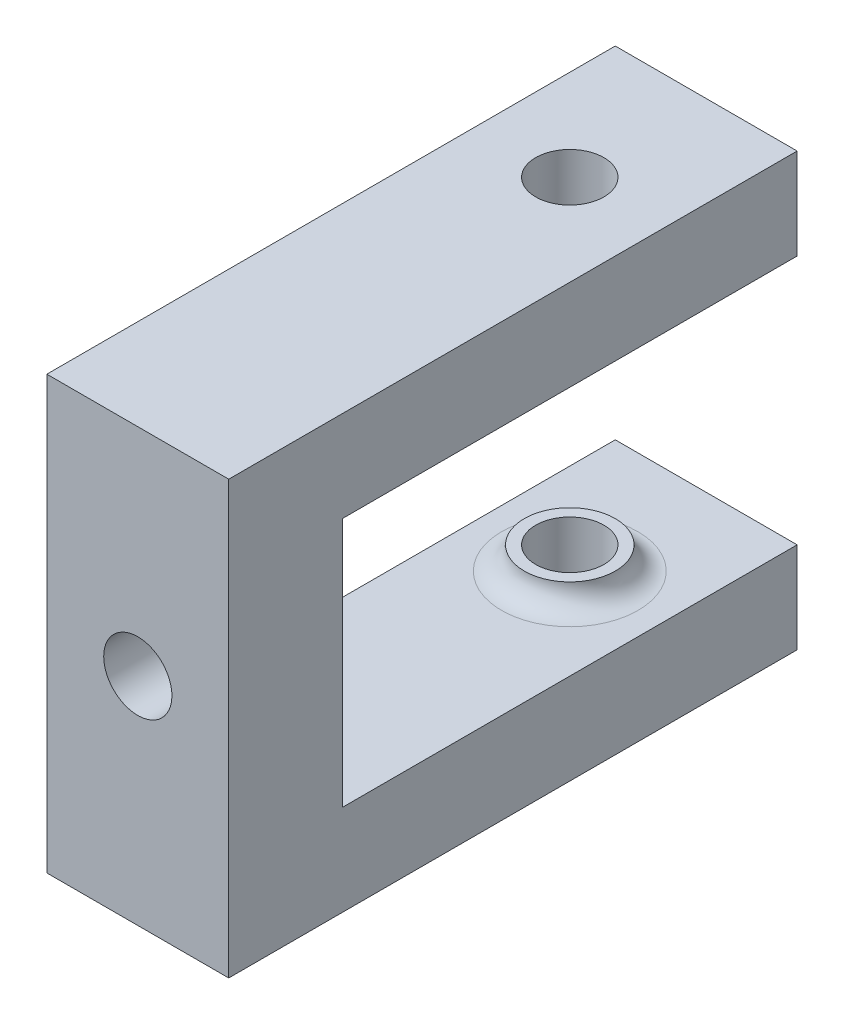
ISO-10303-21;
HEADER;
FILE_DESCRIPTION(('STEP AP214'),'2;1');
FILE_NAME('part.step','',(''),(''),'','','');
FILE_SCHEMA(('AUTOMOTIVE_DESIGN { 1 0 10303 214 1 1 1 1 }'));
ENDSEC;
DATA;
#1=APPLICATION_CONTEXT('core data for automotive mechanical design processes');
#2=APPLICATION_PROTOCOL_DEFINITION('international standard','automotive_design',2000,#1);
#3=PRODUCT_CONTEXT('',#1,'mechanical');
#4=PRODUCT('Part','Part','',(#3));
#5=PRODUCT_RELATED_PRODUCT_CATEGORY('part','',(#4));
#6=PRODUCT_DEFINITION_FORMATION('','',#4);
#7=PRODUCT_DEFINITION_CONTEXT('part definition',#1,'design');
#8=PRODUCT_DEFINITION('design','',#6,#7);
#9=PRODUCT_DEFINITION_SHAPE('','',#8);
#10=(LENGTH_UNIT() NAMED_UNIT(*) SI_UNIT(.MILLI.,.METRE.));
#11=(NAMED_UNIT(*) PLANE_ANGLE_UNIT() SI_UNIT($,.RADIAN.));
#12=(NAMED_UNIT(*) SI_UNIT($,.STERADIAN.) SOLID_ANGLE_UNIT());
#13=UNCERTAINTY_MEASURE_WITH_UNIT(LENGTH_MEASURE(1.E-05),#10,'distance_accuracy_value','');
#14=(GEOMETRIC_REPRESENTATION_CONTEXT(3) GLOBAL_UNCERTAINTY_ASSIGNED_CONTEXT((#13)) GLOBAL_UNIT_ASSIGNED_CONTEXT((#10,
#11,#12)) REPRESENTATION_CONTEXT('',''));
#15=CARTESIAN_POINT('',(0.,0.,0.));
#16=DIRECTION('',(0.,0.,1.));
#17=DIRECTION('',(1.,0.,0.));
#18=AXIS2_PLACEMENT_3D('',#15,#16,#17);
#19=CARTESIAN_POINT('',(4.,9.5,4.24264068711928));
#20=DIRECTION('',(0.,0.,-1.));
#21=DIRECTION('',(-1.,0.,0.));
#22=AXIS2_PLACEMENT_3D('',#19,#20,#21);
#23=CYLINDRICAL_SURFACE('',#22,1.5);
#24=CARTESIAN_POINT('',(4.,9.5,0.));
#25=DIRECTION('',(0.,0.,-1.));
#26=DIRECTION('',(0.,1.,0.));
#27=AXIS2_PLACEMENT_3D('',#24,#25,#26);
#28=CIRCLE('',#27,1.5);
#29=CARTESIAN_POINT('',(4.,11.,0.));
#30=VERTEX_POINT('',#29);
#31=EDGE_CURVE('E281',#30,#30,#28,.F.);
#32=ORIENTED_EDGE('',*,*,#31,.T.);
#33=EDGE_LOOP('',(#32));
#34=FACE_BOUND('',#33,.T.);
#35=CARTESIAN_POINT('',(4.,9.5,-3.));
#36=DIRECTION('',(0.,0.,-1.));
#37=DIRECTION('',(-1.,0.,0.));
#38=AXIS2_PLACEMENT_3D('',#35,#36,#37);
#39=CIRCLE('',#38,1.5);
#40=CARTESIAN_POINT('',(2.5,9.5,-3.));
#41=VERTEX_POINT('',#40);
#42=EDGE_CURVE('E39',#41,#41,#39,.F.);
#43=ORIENTED_EDGE('',*,*,#42,.F.);
#44=EDGE_LOOP('',(#43));
#45=FACE_BOUND('',#44,.T.);
#46=ADVANCED_FACE('F35',(#34,#45),#23,.F.);
#47=CARTESIAN_POINT('',(8.,15.,-5.));
#48=DIRECTION('',(0.,1.,0.));
#49=DIRECTION('',(0.,0.,1.));
#50=AXIS2_PLACEMENT_3D('',#47,#48,#49);
#51=PLANE('',#50);
#52=CARTESIAN_POINT('',(4.,15.,-19.));
#53=DIRECTION('',(0.,1.,0.));
#54=DIRECTION('',(0.,0.,1.));
#55=AXIS2_PLACEMENT_3D('',#52,#53,#54);
#56=CIRCLE('',#55,3.);
#57=CARTESIAN_POINT('',(4.,15.,-16.));
#58=VERTEX_POINT('',#57);
#59=EDGE_CURVE('E11',#58,#58,#56,.T.);
#60=ORIENTED_EDGE('',*,*,#59,.T.);
#61=EDGE_LOOP('',(#60));
#62=FACE_BOUND('',#61,.T.);
#63=DIRECTION('',(0.,0.,-1.));
#64=VECTOR('',#63,1.);
#65=CARTESIAN_POINT('',(0.,15.,-5.));
#66=LINE('',#65,#64);
#67=CARTESIAN_POINT('',(0.,15.,-5.));
#68=VERTEX_POINT('',#67);
#69=CARTESIAN_POINT('',(0.,15.,-25.));
#70=VERTEX_POINT('',#69);
#71=EDGE_CURVE('E134',#68,#70,#66,.T.);
#72=ORIENTED_EDGE('',*,*,#71,.T.);
#73=DIRECTION('',(-1.,0.,0.));
#74=VECTOR('',#73,1.);
#75=CARTESIAN_POINT('',(8.,15.,-25.));
#76=LINE('',#75,#74);
#77=CARTESIAN_POINT('',(8.,15.,-25.));
#78=VERTEX_POINT('',#77);
#79=EDGE_CURVE('E131',#78,#70,#76,.T.);
#80=ORIENTED_EDGE('',*,*,#79,.F.);
#81=DIRECTION('',(0.,0.,-1.));
#82=VECTOR('',#81,1.);
#83=CARTESIAN_POINT('',(8.,15.,-5.));
#84=LINE('',#83,#82);
#85=CARTESIAN_POINT('',(8.,15.,-5.));
#86=VERTEX_POINT('',#85);
#87=EDGE_CURVE('E118',#86,#78,#84,.T.);
#88=ORIENTED_EDGE('',*,*,#87,.F.);
#89=DIRECTION('',(-1.,0.,0.));
#90=VECTOR('',#89,1.);
#91=CARTESIAN_POINT('',(8.,15.,-5.));
#92=LINE('',#91,#90);
#93=EDGE_CURVE('E137',#86,#68,#92,.T.);
#94=ORIENTED_EDGE('',*,*,#93,.T.);
#95=EDGE_LOOP('',(#72,#80,#88,#94));
#96=FACE_BOUND('',#95,.T.);
#97=ADVANCED_FACE('F132',(#62,#96),#51,.F.);
#98=CARTESIAN_POINT('',(8.,4.,-25.));
#99=DIRECTION('',(0.,-1.,0.));
#100=DIRECTION('',(0.,0.,-1.));
#101=AXIS2_PLACEMENT_3D('',#98,#99,#100);
#102=PLANE('',#101);
#103=CARTESIAN_POINT('',(4.,4.,-19.));
#104=DIRECTION('',(0.,-1.,0.));
#105=DIRECTION('',(0.,0.,-1.));
#106=AXIS2_PLACEMENT_3D('',#103,#104,#105);
#107=CIRCLE('',#106,3.);
#108=CARTESIAN_POINT('',(4.,4.,-22.));
#109=VERTEX_POINT('',#108);
#110=EDGE_CURVE('E44',#109,#109,#107,.T.);
#111=ORIENTED_EDGE('',*,*,#110,.T.);
#112=EDGE_LOOP('',(#111));
#113=FACE_BOUND('',#112,.T.);
#114=DIRECTION('',(0.,0.,1.));
#115=VECTOR('',#114,1.);
#116=CARTESIAN_POINT('',(0.,4.,-25.));
#117=LINE('',#116,#115);
#118=CARTESIAN_POINT('',(0.,4.,-25.));
#119=VERTEX_POINT('',#118);
#120=CARTESIAN_POINT('',(0.,4.,-5.));
#121=VERTEX_POINT('',#120);
#122=EDGE_CURVE('E154',#119,#121,#117,.T.);
#123=ORIENTED_EDGE('',*,*,#122,.T.);
#124=DIRECTION('',(-1.,0.,0.));
#125=VECTOR('',#124,1.);
#126=CARTESIAN_POINT('',(8.,4.,-5.));
#127=LINE('',#126,#125);
#128=CARTESIAN_POINT('',(8.,4.,-5.));
#129=VERTEX_POINT('',#128);
#130=EDGE_CURVE('E166',#129,#121,#127,.T.);
#131=ORIENTED_EDGE('',*,*,#130,.F.);
#132=DIRECTION('',(0.,0.,1.));
#133=VECTOR('',#132,1.);
#134=CARTESIAN_POINT('',(8.,4.,-25.));
#135=LINE('',#134,#133);
#136=CARTESIAN_POINT('',(8.,4.,-25.));
#137=VERTEX_POINT('',#136);
#138=EDGE_CURVE('E207',#137,#129,#135,.T.);
#139=ORIENTED_EDGE('',*,*,#138,.F.);
#140=DIRECTION('',(-1.,0.,0.));
#141=VECTOR('',#140,1.);
#142=CARTESIAN_POINT('',(8.,4.,-25.));
#143=LINE('',#142,#141);
#144=EDGE_CURVE('E169',#137,#119,#143,.T.);
#145=ORIENTED_EDGE('',*,*,#144,.T.);
#146=EDGE_LOOP('',(#123,#131,#139,#145));
#147=FACE_BOUND('',#146,.T.);
#148=ADVANCED_FACE('F180',(#113,#147),#102,.F.);
#149=CARTESIAN_POINT('',(8.,19.,0.));
#150=DIRECTION('',(0.,0.,-1.));
#151=DIRECTION('',(0.,1.,0.));
#152=AXIS2_PLACEMENT_3D('',#149,#150,#151);
#153=PLANE('',#152);
#154=ORIENTED_EDGE('',*,*,#31,.F.);
#155=EDGE_LOOP('',(#154));
#156=FACE_BOUND('',#155,.T.);
#157=DIRECTION('',(0.,-1.,0.));
#158=VECTOR('',#157,1.);
#159=CARTESIAN_POINT('',(0.,19.,0.));
#160=LINE('',#159,#158);
#161=CARTESIAN_POINT('',(0.,19.,0.));
#162=VERTEX_POINT('',#161);
#163=CARTESIAN_POINT('',(0.,0.,0.));
#164=VERTEX_POINT('',#163);
#165=EDGE_CURVE('E146',#162,#164,#160,.T.);
#166=ORIENTED_EDGE('',*,*,#165,.T.);
#167=DIRECTION('',(-1.,0.,0.));
#168=VECTOR('',#167,1.);
#169=CARTESIAN_POINT('',(8.,0.,0.));
#170=LINE('',#169,#168);
#171=CARTESIAN_POINT('',(8.,0.,0.));
#172=VERTEX_POINT('',#171);
#173=EDGE_CURVE('E175',#172,#164,#170,.T.);
#174=ORIENTED_EDGE('',*,*,#173,.F.);
#175=DIRECTION('',(0.,-1.,0.));
#176=VECTOR('',#175,1.);
#177=CARTESIAN_POINT('',(8.,19.,0.));
#178=LINE('',#177,#176);
#179=CARTESIAN_POINT('',(8.,19.,0.));
#180=VERTEX_POINT('',#179);
#181=EDGE_CURVE('E162',#180,#172,#178,.T.);
#182=ORIENTED_EDGE('',*,*,#181,.F.);
#183=DIRECTION('',(-1.,0.,0.));
#184=VECTOR('',#183,1.);
#185=CARTESIAN_POINT('',(8.,19.,0.));
#186=LINE('',#185,#184);
#187=EDGE_CURVE('E142',#180,#162,#186,.T.);
#188=ORIENTED_EDGE('',*,*,#187,.T.);
#189=EDGE_LOOP('',(#166,#174,#182,#188));
#190=FACE_BOUND('',#189,.T.);
#191=ADVANCED_FACE('F223',(#156,#190),#153,.F.);
#192=CARTESIAN_POINT('',(8.,0.,0.));
#193=DIRECTION('',(0.,1.,0.));
#194=DIRECTION('',(0.,0.,1.));
#195=AXIS2_PLACEMENT_3D('',#192,#193,#194);
#196=PLANE('',#195);
#197=CARTESIAN_POINT('',(4.,0.,-19.));
#198=DIRECTION('',(0.,1.,0.));
#199=DIRECTION('',(0.,0.,1.));
#200=AXIS2_PLACEMENT_3D('',#197,#198,#199);
#201=CIRCLE('',#200,1.5);
#202=CARTESIAN_POINT('',(4.,0.,-17.5));
#203=VERTEX_POINT('',#202);
#204=EDGE_CURVE('E150',#203,#203,#201,.F.);
#205=ORIENTED_EDGE('',*,*,#204,.F.);
#206=EDGE_LOOP('',(#205));
#207=FACE_BOUND('',#206,.T.);
#208=DIRECTION('',(0.,0.,-1.));
#209=VECTOR('',#208,1.);
#210=CARTESIAN_POINT('',(0.,0.,0.));
#211=LINE('',#210,#209);
#212=CARTESIAN_POINT('',(0.,0.,-25.));
#213=VERTEX_POINT('',#212);
#214=EDGE_CURVE('E149',#164,#213,#211,.T.);
#215=ORIENTED_EDGE('',*,*,#214,.T.);
#216=DIRECTION('',(-1.,0.,0.));
#217=VECTOR('',#216,1.);
#218=CARTESIAN_POINT('',(8.,0.,-25.));
#219=LINE('',#218,#217);
#220=CARTESIAN_POINT('',(8.,0.,-25.));
#221=VERTEX_POINT('',#220);
#222=EDGE_CURVE('E172',#221,#213,#219,.T.);
#223=ORIENTED_EDGE('',*,*,#222,.F.);
#224=DIRECTION('',(0.,0.,-1.));
#225=VECTOR('',#224,1.);
#226=CARTESIAN_POINT('',(8.,0.,0.));
#227=LINE('',#226,#225);
#228=EDGE_CURVE('E102',#172,#221,#227,.T.);
#229=ORIENTED_EDGE('',*,*,#228,.F.);
#230=ORIENTED_EDGE('',*,*,#173,.T.);
#231=EDGE_LOOP('',(#215,#223,#229,#230));
#232=FACE_BOUND('',#231,.T.);
#233=ADVANCED_FACE('F224',(#207,#232),#196,.F.);
#234=CARTESIAN_POINT('',(8.,0.,-25.));
#235=DIRECTION('',(0.,0.,1.));
#236=DIRECTION('',(1.,0.,0.));
#237=AXIS2_PLACEMENT_3D('',#234,#235,#236);
#238=PLANE('',#237);
#239=DIRECTION('',(0.,1.,0.));
#240=VECTOR('',#239,1.);
#241=CARTESIAN_POINT('',(0.,0.,-25.));
#242=LINE('',#241,#240);
#243=EDGE_CURVE('E152',#213,#119,#242,.T.);
#244=ORIENTED_EDGE('',*,*,#243,.T.);
#245=ORIENTED_EDGE('',*,*,#144,.F.);
#246=DIRECTION('',(0.,1.,0.));
#247=VECTOR('',#246,1.);
#248=CARTESIAN_POINT('',(8.,0.,-25.));
#249=LINE('',#248,#247);
#250=EDGE_CURVE('E205',#221,#137,#249,.T.);
#251=ORIENTED_EDGE('',*,*,#250,.F.);
#252=ORIENTED_EDGE('',*,*,#222,.T.);
#253=EDGE_LOOP('',(#244,#245,#251,#252));
#254=FACE_BOUND('',#253,.T.);
#255=ADVANCED_FACE('F227',(#254),#238,.F.);
#256=CARTESIAN_POINT('',(8.,4.,-5.));
#257=DIRECTION('',(0.,0.,1.));
#258=DIRECTION('',(1.,0.,0.));
#259=AXIS2_PLACEMENT_3D('',#256,#257,#258);
#260=PLANE('',#259);
#261=DIRECTION('',(0.870404047279502,0.492338089608616,0.));
#262=VECTOR('',#261,1.);
#263=CARTESIAN_POINT('',(1.26411822332476,11.1119194264571,-5.));
#264=LINE('',#263,#262);
#265=CARTESIAN_POINT('',(1.26411822332476,11.1119194264571,-5.));
#266=VERTEX_POINT('',#265);
#267=CARTESIAN_POINT('',(4.02802228382785,12.6753028335802,-5.));
#268=VERTEX_POINT('',#267);
#269=EDGE_CURVE('E334',#266,#268,#264,.T.);
#270=ORIENTED_EDGE('',*,*,#269,.F.);
#271=DIRECTION('',(0.00882473078798997,0.999961061305149,0.));
#272=VECTOR('',#271,1.);
#273=CARTESIAN_POINT('',(1.23609593949692,7.93661659287687,-5.));
#274=LINE('',#273,#272);
#275=CARTESIAN_POINT('',(1.23609593949692,7.93661659287687,-5.));
#276=VERTEX_POINT('',#275);
#277=EDGE_CURVE('E51',#276,#266,#274,.T.);
#278=ORIENTED_EDGE('',*,*,#277,.F.);
#279=DIRECTION('',(-0.861579316491512,0.507622971696533,0.));
#280=VECTOR('',#279,1.);
#281=CARTESIAN_POINT('',(3.97197771617216,6.3246971664198,-5.));
#282=LINE('',#281,#280);
#283=CARTESIAN_POINT('',(3.97197771617216,6.3246971664198,-5.));
#284=VERTEX_POINT('',#283);
#285=EDGE_CURVE('E358',#284,#276,#282,.T.);
#286=ORIENTED_EDGE('',*,*,#285,.F.);
#287=DIRECTION('',(-0.870404047279502,-0.492338089608617,0.));
#288=VECTOR('',#287,1.);
#289=CARTESIAN_POINT('',(6.73588177667524,7.88808057354293,-5.));
#290=LINE('',#289,#288);
#291=CARTESIAN_POINT('',(6.73588177667524,7.88808057354293,-5.));
#292=VERTEX_POINT('',#291);
#293=EDGE_CURVE('E352',#292,#284,#290,.T.);
#294=ORIENTED_EDGE('',*,*,#293,.F.);
#295=DIRECTION('',(-0.0088247307879899,-0.999961061305149,0.));
#296=VECTOR('',#295,1.);
#297=CARTESIAN_POINT('',(6.76390406050308,11.0633834071231,-5.));
#298=LINE('',#297,#296);
#299=CARTESIAN_POINT('',(6.76390406050308,11.0633834071231,-5.));
#300=VERTEX_POINT('',#299);
#301=EDGE_CURVE('E349',#300,#292,#298,.T.);
#302=ORIENTED_EDGE('',*,*,#301,.F.);
#303=DIRECTION('',(0.861579316491513,-0.507622971696532,0.));
#304=VECTOR('',#303,1.);
#305=CARTESIAN_POINT('',(4.02802228382785,12.6753028335802,-5.));
#306=LINE('',#305,#304);
#307=EDGE_CURVE('E343',#268,#300,#306,.T.);
#308=ORIENTED_EDGE('',*,*,#307,.F.);
#309=EDGE_LOOP('',(#270,#278,#286,#294,#302,#308));
#310=FACE_BOUND('',#309,.T.);
#311=DIRECTION('',(0.,1.,0.));
#312=VECTOR('',#311,1.);
#313=CARTESIAN_POINT('',(0.,4.,-5.));
#314=LINE('',#313,#312);
#315=EDGE_CURVE('E156',#121,#68,#314,.T.);
#316=ORIENTED_EDGE('',*,*,#315,.T.);
#317=ORIENTED_EDGE('',*,*,#93,.F.);
#318=DIRECTION('',(0.,1.,0.));
#319=VECTOR('',#318,1.);
#320=CARTESIAN_POINT('',(8.,4.,-5.));
#321=LINE('',#320,#319);
#322=EDGE_CURVE('E125',#129,#86,#321,.T.);
#323=ORIENTED_EDGE('',*,*,#322,.F.);
#324=ORIENTED_EDGE('',*,*,#130,.T.);
#325=EDGE_LOOP('',(#316,#317,#323,#324));
#326=FACE_BOUND('',#325,.T.);
#327=ADVANCED_FACE('F215',(#310,#326),#260,.F.);
#328=CARTESIAN_POINT('',(8.,15.,-25.));
#329=DIRECTION('',(0.,0.,1.));
#330=DIRECTION('',(1.,0.,0.));
#331=AXIS2_PLACEMENT_3D('',#328,#329,#330);
#332=PLANE('',#331);
#333=DIRECTION('',(0.,1.,0.));
#334=VECTOR('',#333,1.);
#335=CARTESIAN_POINT('',(0.,15.,-25.));
#336=LINE('',#335,#334);
#337=CARTESIAN_POINT('',(0.,19.,-25.));
#338=VERTEX_POINT('',#337);
#339=EDGE_CURVE('E159',#70,#338,#336,.T.);
#340=ORIENTED_EDGE('',*,*,#339,.T.);
#341=DIRECTION('',(-1.,0.,0.));
#342=VECTOR('',#341,1.);
#343=CARTESIAN_POINT('',(8.,19.,-25.));
#344=LINE('',#343,#342);
#345=CARTESIAN_POINT('',(8.,19.,-25.));
#346=VERTEX_POINT('',#345);
#347=EDGE_CURVE('E138',#346,#338,#344,.T.);
#348=ORIENTED_EDGE('',*,*,#347,.F.);
#349=DIRECTION('',(0.,1.,0.));
#350=VECTOR('',#349,1.);
#351=CARTESIAN_POINT('',(8.,15.,-25.));
#352=LINE('',#351,#350);
#353=EDGE_CURVE('E122',#78,#346,#352,.T.);
#354=ORIENTED_EDGE('',*,*,#353,.F.);
#355=ORIENTED_EDGE('',*,*,#79,.T.);
#356=EDGE_LOOP('',(#340,#348,#354,#355));
#357=FACE_BOUND('',#356,.T.);
#358=ADVANCED_FACE('F140',(#357),#332,.F.);
#359=CARTESIAN_POINT('',(8.,19.,-25.));
#360=DIRECTION('',(0.,-1.,0.));
#361=DIRECTION('',(0.,0.,-1.));
#362=AXIS2_PLACEMENT_3D('',#359,#360,#361);
#363=PLANE('',#362);
#364=CARTESIAN_POINT('',(4.,19.,-19.));
#365=DIRECTION('',(0.,1.,0.));
#366=DIRECTION('',(0.,0.,1.));
#367=AXIS2_PLACEMENT_3D('',#364,#365,#366);
#368=CIRCLE('',#367,1.5);
#369=CARTESIAN_POINT('',(4.,19.,-17.5));
#370=VERTEX_POINT('',#369);
#371=EDGE_CURVE('E191',#370,#370,#368,.T.);
#372=ORIENTED_EDGE('',*,*,#371,.F.);
#373=EDGE_LOOP('',(#372));
#374=FACE_BOUND('',#373,.T.);
#375=DIRECTION('',(0.,0.,1.));
#376=VECTOR('',#375,1.);
#377=CARTESIAN_POINT('',(0.,19.,-25.));
#378=LINE('',#377,#376);
#379=EDGE_CURVE('E93',#338,#162,#378,.T.);
#380=ORIENTED_EDGE('',*,*,#379,.T.);
#381=ORIENTED_EDGE('',*,*,#187,.F.);
#382=DIRECTION('',(0.,0.,1.));
#383=VECTOR('',#382,1.);
#384=CARTESIAN_POINT('',(8.,19.,-25.));
#385=LINE('',#384,#383);
#386=EDGE_CURVE('E60',#346,#180,#385,.T.);
#387=ORIENTED_EDGE('',*,*,#386,.F.);
#388=ORIENTED_EDGE('',*,*,#347,.T.);
#389=EDGE_LOOP('',(#380,#381,#387,#388));
#390=FACE_BOUND('',#389,.T.);
#391=ADVANCED_FACE('F219',(#374,#390),#363,.F.);
#392=CARTESIAN_POINT('',(8.,0.,0.));
#393=DIRECTION('',(1.,0.,0.));
#394=DIRECTION('',(0.,0.,-1.));
#395=AXIS2_PLACEMENT_3D('',#392,#393,#394);
#396=PLANE('',#395);
#397=ORIENTED_EDGE('',*,*,#181,.T.);
#398=ORIENTED_EDGE('',*,*,#228,.T.);
#399=ORIENTED_EDGE('',*,*,#250,.T.);
#400=ORIENTED_EDGE('',*,*,#138,.T.);
#401=ORIENTED_EDGE('',*,*,#322,.T.);
#402=ORIENTED_EDGE('',*,*,#87,.T.);
#403=ORIENTED_EDGE('',*,*,#353,.T.);
#404=ORIENTED_EDGE('',*,*,#386,.T.);
#405=EDGE_LOOP('',(#397,#398,#399,#400,#401,#402,#403,#404));
#406=FACE_BOUND('',#405,.T.);
#407=ADVANCED_FACE('F120',(#406),#396,.T.);
#408=CARTESIAN_POINT('',(0.,0.,0.));
#409=DIRECTION('',(1.,0.,0.));
#410=DIRECTION('',(0.,0.,-1.));
#411=AXIS2_PLACEMENT_3D('',#408,#409,#410);
#412=PLANE('',#411);
#413=ORIENTED_EDGE('',*,*,#165,.F.);
#414=ORIENTED_EDGE('',*,*,#379,.F.);
#415=ORIENTED_EDGE('',*,*,#339,.F.);
#416=ORIENTED_EDGE('',*,*,#71,.F.);
#417=ORIENTED_EDGE('',*,*,#315,.F.);
#418=ORIENTED_EDGE('',*,*,#122,.F.);
#419=ORIENTED_EDGE('',*,*,#243,.F.);
#420=ORIENTED_EDGE('',*,*,#214,.F.);
#421=EDGE_LOOP('',(#413,#414,#415,#416,#417,#418,#419,#420));
#422=FACE_BOUND('',#421,.T.);
#423=ADVANCED_FACE('F218',(#422),#412,.F.);
#424=CARTESIAN_POINT('',(4.,-4.24264068711929,-19.));
#425=DIRECTION('',(0.,1.,0.));
#426=DIRECTION('',(0.,0.,1.));
#427=AXIS2_PLACEMENT_3D('',#424,#425,#426);
#428=CYLINDRICAL_SURFACE('',#427,1.5);
#429=ORIENTED_EDGE('',*,*,#371,.T.);
#430=EDGE_LOOP('',(#429));
#431=FACE_BOUND('',#430,.T.);
#432=CARTESIAN_POINT('',(4.,14.,-19.));
#433=DIRECTION('',(0.,-1.,0.));
#434=DIRECTION('',(0.,0.,-1.));
#435=AXIS2_PLACEMENT_3D('',#432,#433,#434);
#436=CIRCLE('',#435,1.5);
#437=CARTESIAN_POINT('',(4.,14.,-20.5));
#438=VERTEX_POINT('',#437);
#439=EDGE_CURVE('E282',#438,#438,#436,.T.);
#440=ORIENTED_EDGE('',*,*,#439,.T.);
#441=EDGE_LOOP('',(#440));
#442=FACE_BOUND('',#441,.T.);
#443=ADVANCED_FACE('F262',(#431,#442),#428,.F.);
#444=ORIENTED_EDGE('',*,*,#204,.T.);
#445=EDGE_LOOP('',(#444));
#446=FACE_BOUND('',#445,.T.);
#447=CARTESIAN_POINT('',(4.,5.,-19.));
#448=DIRECTION('',(0.,1.,0.));
#449=DIRECTION('',(0.,0.,1.));
#450=AXIS2_PLACEMENT_3D('',#447,#448,#449);
#451=CIRCLE('',#450,1.5);
#452=CARTESIAN_POINT('',(4.,5.,-17.5));
#453=VERTEX_POINT('',#452);
#454=EDGE_CURVE('E192',#453,#453,#451,.T.);
#455=ORIENTED_EDGE('',*,*,#454,.T.);
#456=EDGE_LOOP('',(#455));
#457=FACE_BOUND('',#456,.T.);
#458=ADVANCED_FACE('F259',(#446,#457),#428,.F.);
#459=CARTESIAN_POINT('',(4.,5.,-19.));
#460=DIRECTION('',(0.,1.,0.));
#461=DIRECTION('',(0.,0.,1.));
#462=AXIS2_PLACEMENT_3D('',#459,#460,#461);
#463=PLANE('',#462);
#464=CARTESIAN_POINT('',(4.,5.,-19.));
#465=DIRECTION('',(0.,1.,0.));
#466=DIRECTION('',(0.,0.,1.));
#467=AXIS2_PLACEMENT_3D('',#464,#465,#466);
#468=CIRCLE('',#467,2.);
#469=CARTESIAN_POINT('',(4.,5.,-17.));
#470=VERTEX_POINT('',#469);
#471=EDGE_CURVE('E189',#470,#470,#468,.T.);
#472=ORIENTED_EDGE('',*,*,#471,.T.);
#473=EDGE_LOOP('',(#472));
#474=FACE_BOUND('',#473,.T.);
#475=ORIENTED_EDGE('',*,*,#454,.F.);
#476=EDGE_LOOP('',(#475));
#477=FACE_BOUND('',#476,.T.);
#478=ADVANCED_FACE('F255',(#474,#477),#463,.T.);
#479=CARTESIAN_POINT('',(4.,14.,-19.));
#480=DIRECTION('',(0.,-1.,0.));
#481=DIRECTION('',(0.,0.,-1.));
#482=AXIS2_PLACEMENT_3D('',#479,#480,#481);
#483=PLANE('',#482);
#484=CARTESIAN_POINT('',(4.,14.,-19.));
#485=DIRECTION('',(0.,-1.,0.));
#486=DIRECTION('',(0.,0.,-1.));
#487=AXIS2_PLACEMENT_3D('',#484,#485,#486);
#488=CIRCLE('',#487,2.);
#489=CARTESIAN_POINT('',(4.,14.,-21.));
#490=VERTEX_POINT('',#489);
#491=EDGE_CURVE('E197',#490,#490,#488,.T.);
#492=ORIENTED_EDGE('',*,*,#491,.T.);
#493=EDGE_LOOP('',(#492));
#494=FACE_BOUND('',#493,.T.);
#495=ORIENTED_EDGE('',*,*,#439,.F.);
#496=EDGE_LOOP('',(#495));
#497=FACE_BOUND('',#496,.T.);
#498=ADVANCED_FACE('F186',(#494,#497),#483,.T.);
#499=CARTESIAN_POINT('',(4.,5.,-19.));
#500=DIRECTION('',(0.,-1.,0.));
#501=DIRECTION('',(0.,0.,-1.));
#502=AXIS2_PLACEMENT_3D('',#499,#500,#501);
#503=TOROIDAL_SURFACE('',#502,3.,1.);
#504=ORIENTED_EDGE('',*,*,#110,.F.);
#505=EDGE_LOOP('',(#504));
#506=FACE_BOUND('',#505,.T.);
#507=ORIENTED_EDGE('',*,*,#471,.F.);
#508=EDGE_LOOP('',(#507));
#509=FACE_BOUND('',#508,.T.);
#510=ADVANCED_FACE('F183',(#506,#509),#503,.F.);
#511=CARTESIAN_POINT('',(4.,14.,-19.));
#512=DIRECTION('',(0.,1.,0.));
#513=DIRECTION('',(0.,0.,1.));
#514=AXIS2_PLACEMENT_3D('',#511,#512,#513);
#515=TOROIDAL_SURFACE('',#514,3.,1.);
#516=ORIENTED_EDGE('',*,*,#59,.F.);
#517=EDGE_LOOP('',(#516));
#518=FACE_BOUND('',#517,.T.);
#519=ORIENTED_EDGE('',*,*,#491,.F.);
#520=EDGE_LOOP('',(#519));
#521=FACE_BOUND('',#520,.T.);
#522=ADVANCED_FACE('F37',(#518,#521),#515,.F.);
#523=CARTESIAN_POINT('',(0.,0.,-3.));
#524=DIRECTION('',(0.,0.,-1.));
#525=DIRECTION('',(-1.,0.,0.));
#526=AXIS2_PLACEMENT_3D('',#523,#524,#525);
#527=PLANE('',#526);
#528=DIRECTION('',(0.00882473078798997,0.999961061305149,0.));
#529=VECTOR('',#528,1.);
#530=CARTESIAN_POINT('',(1.23609593949692,7.93661659287687,-3.));
#531=LINE('',#530,#529);
#532=CARTESIAN_POINT('',(1.23609593949692,7.93661659287687,-3.));
#533=VERTEX_POINT('',#532);
#534=CARTESIAN_POINT('',(1.26411822332476,11.1119194264571,-3.));
#535=VERTEX_POINT('',#534);
#536=EDGE_CURVE('E361',#533,#535,#531,.T.);
#537=ORIENTED_EDGE('',*,*,#536,.T.);
#538=DIRECTION('',(0.870404047279502,0.492338089608616,0.));
#539=VECTOR('',#538,1.);
#540=CARTESIAN_POINT('',(1.26411822332476,11.1119194264571,-3.));
#541=LINE('',#540,#539);
#542=CARTESIAN_POINT('',(4.02802228382785,12.6753028335802,-3.));
#543=VERTEX_POINT('',#542);
#544=EDGE_CURVE('E385',#535,#543,#541,.T.);
#545=ORIENTED_EDGE('',*,*,#544,.T.);
#546=DIRECTION('',(0.861579316491513,-0.507622971696532,0.));
#547=VECTOR('',#546,1.);
#548=CARTESIAN_POINT('',(4.02802228382785,12.6753028335802,-3.));
#549=LINE('',#548,#547);
#550=CARTESIAN_POINT('',(6.76390406050308,11.0633834071231,-3.));
#551=VERTEX_POINT('',#550);
#552=EDGE_CURVE('E382',#543,#551,#549,.T.);
#553=ORIENTED_EDGE('',*,*,#552,.T.);
#554=DIRECTION('',(-0.0088247307879899,-0.999961061305149,0.));
#555=VECTOR('',#554,1.);
#556=CARTESIAN_POINT('',(6.76390406050308,11.0633834071231,-3.));
#557=LINE('',#556,#555);
#558=CARTESIAN_POINT('',(6.73588177667524,7.88808057354293,-3.));
#559=VERTEX_POINT('',#558);
#560=EDGE_CURVE('E377',#551,#559,#557,.T.);
#561=ORIENTED_EDGE('',*,*,#560,.T.);
#562=DIRECTION('',(-0.870404047279502,-0.492338089608617,0.));
#563=VECTOR('',#562,1.);
#564=CARTESIAN_POINT('',(6.73588177667524,7.88808057354293,-3.));
#565=LINE('',#564,#563);
#566=CARTESIAN_POINT('',(3.97197771617216,6.3246971664198,-3.));
#567=VERTEX_POINT('',#566);
#568=EDGE_CURVE('E373',#559,#567,#565,.T.);
#569=ORIENTED_EDGE('',*,*,#568,.T.);
#570=DIRECTION('',(-0.861579316491512,0.507622971696533,0.));
#571=VECTOR('',#570,1.);
#572=CARTESIAN_POINT('',(3.97197771617216,6.3246971664198,-3.));
#573=LINE('',#572,#571);
#574=EDGE_CURVE('E371',#567,#533,#573,.T.);
#575=ORIENTED_EDGE('',*,*,#574,.T.);
#576=EDGE_LOOP('',(#537,#545,#553,#561,#569,#575));
#577=FACE_BOUND('',#576,.T.);
#578=ORIENTED_EDGE('',*,*,#42,.T.);
#579=EDGE_LOOP('',(#578));
#580=FACE_BOUND('',#579,.T.);
#581=ADVANCED_FACE('F296',(#577,#580),#527,.T.);
#582=CARTESIAN_POINT('',(1.23609593949692,7.93661659287687,-3.));
#583=DIRECTION('',(-0.999961061305149,0.00882473078798997,0.));
#584=DIRECTION('',(-0.00882473078798997,-0.999961061305149,0.));
#585=AXIS2_PLACEMENT_3D('',#582,#583,#584);
#586=PLANE('',#585);
#587=ORIENTED_EDGE('',*,*,#277,.T.);
#588=DIRECTION('',(0.,0.,-1.));
#589=VECTOR('',#588,1.);
#590=CARTESIAN_POINT('',(1.26411822332476,11.1119194264571,-3.));
#591=LINE('',#590,#589);
#592=EDGE_CURVE('E289',#535,#266,#591,.T.);
#593=ORIENTED_EDGE('',*,*,#592,.F.);
#594=ORIENTED_EDGE('',*,*,#536,.F.);
#595=DIRECTION('',(0.,0.,-1.));
#596=VECTOR('',#595,1.);
#597=CARTESIAN_POINT('',(1.23609593949692,7.93661659287687,-3.));
#598=LINE('',#597,#596);
#599=EDGE_CURVE('E287',#533,#276,#598,.T.);
#600=ORIENTED_EDGE('',*,*,#599,.T.);
#601=EDGE_LOOP('',(#587,#593,#594,#600));
#602=FACE_BOUND('',#601,.T.);
#603=ADVANCED_FACE('F251',(#602),#586,.F.);
#604=CARTESIAN_POINT('',(3.97197771617216,6.3246971664198,-3.));
#605=DIRECTION('',(-0.507622971696533,-0.861579316491512,0.));
#606=DIRECTION('',(0.861579316491512,-0.507622971696533,0.));
#607=AXIS2_PLACEMENT_3D('',#604,#605,#606);
#608=PLANE('',#607);
#609=ORIENTED_EDGE('',*,*,#285,.T.);
#610=ORIENTED_EDGE('',*,*,#599,.F.);
#611=ORIENTED_EDGE('',*,*,#574,.F.);
#612=DIRECTION('',(0.,0.,-1.));
#613=VECTOR('',#612,1.);
#614=CARTESIAN_POINT('',(3.97197771617216,6.3246971664198,-3.));
#615=LINE('',#614,#613);
#616=EDGE_CURVE('E363',#567,#284,#615,.T.);
#617=ORIENTED_EDGE('',*,*,#616,.T.);
#618=EDGE_LOOP('',(#609,#610,#611,#617));
#619=FACE_BOUND('',#618,.T.);
#620=ADVANCED_FACE('F307',(#619),#608,.F.);
#621=CARTESIAN_POINT('',(6.73588177667524,7.88808057354293,-3.));
#622=DIRECTION('',(0.492338089608617,-0.870404047279502,0.));
#623=DIRECTION('',(0.870404047279502,0.492338089608617,0.));
#624=AXIS2_PLACEMENT_3D('',#621,#622,#623);
#625=PLANE('',#624);
#626=ORIENTED_EDGE('',*,*,#293,.T.);
#627=ORIENTED_EDGE('',*,*,#616,.F.);
#628=ORIENTED_EDGE('',*,*,#568,.F.);
#629=DIRECTION('',(0.,0.,-1.));
#630=VECTOR('',#629,1.);
#631=CARTESIAN_POINT('',(6.73588177667524,7.88808057354293,-3.));
#632=LINE('',#631,#630);
#633=EDGE_CURVE('E366',#559,#292,#632,.T.);
#634=ORIENTED_EDGE('',*,*,#633,.T.);
#635=EDGE_LOOP('',(#626,#627,#628,#634));
#636=FACE_BOUND('',#635,.T.);
#637=ADVANCED_FACE('F313',(#636),#625,.F.);
#638=CARTESIAN_POINT('',(6.76390406050308,11.0633834071231,-3.));
#639=DIRECTION('',(0.999961061305149,-0.0088247307879899,0.));
#640=DIRECTION('',(0.0088247307879899,0.999961061305149,0.));
#641=AXIS2_PLACEMENT_3D('',#638,#639,#640);
#642=PLANE('',#641);
#643=ORIENTED_EDGE('',*,*,#301,.T.);
#644=ORIENTED_EDGE('',*,*,#633,.F.);
#645=ORIENTED_EDGE('',*,*,#560,.F.);
#646=DIRECTION('',(0.,0.,-1.));
#647=VECTOR('',#646,1.);
#648=CARTESIAN_POINT('',(6.76390406050308,11.0633834071231,-3.));
#649=LINE('',#648,#647);
#650=EDGE_CURVE('E369',#551,#300,#649,.T.);
#651=ORIENTED_EDGE('',*,*,#650,.T.);
#652=EDGE_LOOP('',(#643,#644,#645,#651));
#653=FACE_BOUND('',#652,.T.);
#654=ADVANCED_FACE('F317',(#653),#642,.F.);
#655=CARTESIAN_POINT('',(4.02802228382785,12.6753028335802,-3.));
#656=DIRECTION('',(0.507622971696532,0.861579316491513,0.));
#657=DIRECTION('',(-0.861579316491513,0.507622971696532,0.));
#658=AXIS2_PLACEMENT_3D('',#655,#656,#657);
#659=PLANE('',#658);
#660=ORIENTED_EDGE('',*,*,#307,.T.);
#661=ORIENTED_EDGE('',*,*,#650,.F.);
#662=ORIENTED_EDGE('',*,*,#552,.F.);
#663=DIRECTION('',(0.,0.,-1.));
#664=VECTOR('',#663,1.);
#665=CARTESIAN_POINT('',(4.02802228382785,12.6753028335802,-3.));
#666=LINE('',#665,#664);
#667=EDGE_CURVE('E339',#543,#268,#666,.T.);
#668=ORIENTED_EDGE('',*,*,#667,.T.);
#669=EDGE_LOOP('',(#660,#661,#662,#668));
#670=FACE_BOUND('',#669,.T.);
#671=ADVANCED_FACE('F321',(#670),#659,.F.);
#672=CARTESIAN_POINT('',(1.26411822332476,11.1119194264571,-3.));
#673=DIRECTION('',(-0.492338089608616,0.870404047279502,0.));
#674=DIRECTION('',(-0.870404047279503,-0.492338089608616,0.));
#675=AXIS2_PLACEMENT_3D('',#672,#673,#674);
#676=PLANE('',#675);
#677=ORIENTED_EDGE('',*,*,#269,.T.);
#678=ORIENTED_EDGE('',*,*,#667,.F.);
#679=ORIENTED_EDGE('',*,*,#544,.F.);
#680=ORIENTED_EDGE('',*,*,#592,.T.);
#681=EDGE_LOOP('',(#677,#678,#679,#680));
#682=FACE_BOUND('',#681,.T.);
#683=ADVANCED_FACE('F324',(#682),#676,.F.);
#684=CLOSED_SHELL('',(#46,#97,#148,#191,#233,#255,#327,#358,#391,#407,#423,#443,#458,#478,#498,
#510,#522,#581,#603,#620,#637,#654,#671,#683));
#685=MANIFOLD_SOLID_BREP('B2',#684);
#686=ADVANCED_BREP_SHAPE_REPRESENTATION('',(#18,#685),#14);
#687=SHAPE_DEFINITION_REPRESENTATION(#9,#686);
ENDSEC;
END-ISO-10303-21;
